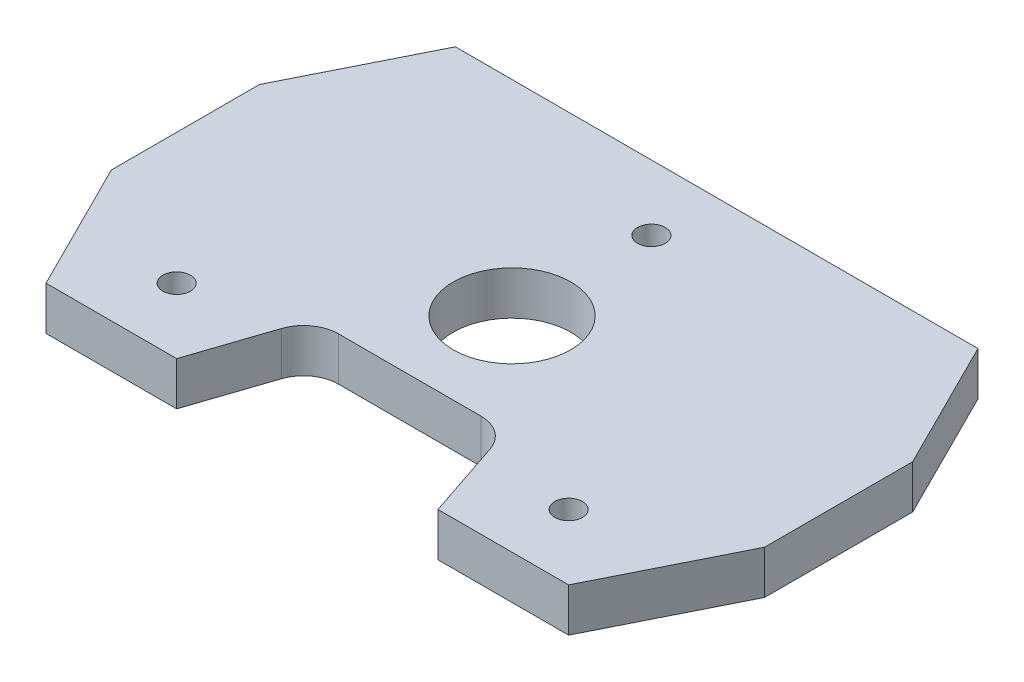
ISO-10303-21;
HEADER;
FILE_DESCRIPTION(('STEP AP214'),'2;1');
FILE_NAME('part.step','',(''),(''),'','','');
FILE_SCHEMA(('AUTOMOTIVE_DESIGN { 1 0 10303 214 1 1 1 1 }'));
ENDSEC;
DATA;
#1=APPLICATION_CONTEXT('core data for automotive mechanical design processes');
#2=APPLICATION_PROTOCOL_DEFINITION('international standard','automotive_design',2000,#1);
#3=PRODUCT_CONTEXT('',#1,'mechanical');
#4=PRODUCT('Part','Part','',(#3));
#5=PRODUCT_RELATED_PRODUCT_CATEGORY('part','',(#4));
#6=PRODUCT_DEFINITION_FORMATION('','',#4);
#7=PRODUCT_DEFINITION_CONTEXT('part definition',#1,'design');
#8=PRODUCT_DEFINITION('design','',#6,#7);
#9=PRODUCT_DEFINITION_SHAPE('','',#8);
#10=(LENGTH_UNIT() NAMED_UNIT(*) SI_UNIT(.MILLI.,.METRE.));
#11=(NAMED_UNIT(*) PLANE_ANGLE_UNIT() SI_UNIT($,.RADIAN.));
#12=(NAMED_UNIT(*) SI_UNIT($,.STERADIAN.) SOLID_ANGLE_UNIT());
#13=UNCERTAINTY_MEASURE_WITH_UNIT(LENGTH_MEASURE(1.E-05),#10,'distance_accuracy_value','');
#14=(GEOMETRIC_REPRESENTATION_CONTEXT(3) GLOBAL_UNCERTAINTY_ASSIGNED_CONTEXT((#13)) GLOBAL_UNIT_ASSIGNED_CONTEXT((#10,
#11,#12)) REPRESENTATION_CONTEXT('',''));
#15=CARTESIAN_POINT('',(0.,0.,0.));
#16=DIRECTION('',(0.,0.,1.));
#17=DIRECTION('',(1.,0.,0.));
#18=AXIS2_PLACEMENT_3D('',#15,#16,#17);
#19=CARTESIAN_POINT('',(-16.364335743494,10.,51.1990291262136));
#20=DIRECTION('',(0.,1.,0.));
#21=DIRECTION('',(0.,0.,1.));
#22=AXIS2_PLACEMENT_3D('',#19,#20,#21);
#23=PLANE('',#22);
#24=CARTESIAN_POINT('',(0.,10.,-12.3009708737864));
#25=DIRECTION('',(0.,1.,0.));
#26=DIRECTION('',(0.,0.,1.));
#27=AXIS2_PLACEMENT_3D('',#24,#25,#26);
#28=CIRCLE('',#27,3.175);
#29=CARTESIAN_POINT('',(0.,10.,-9.12597087378638));
#30=VERTEX_POINT('',#29);
#31=EDGE_CURVE('E316',#30,#30,#28,.T.);
#32=ORIENTED_EDGE('',*,*,#31,.F.);
#33=EDGE_LOOP('',(#32));
#34=FACE_BOUND('',#33,.T.);
#35=CARTESIAN_POINT('',(0.,10.,19.6990291262136));
#36=DIRECTION('',(0.,1.,0.));
#37=DIRECTION('',(0.,0.,1.));
#38=AXIS2_PLACEMENT_3D('',#35,#36,#37);
#39=CIRCLE('',#38,13.5);
#40=CARTESIAN_POINT('',(0.,10.,33.1990291262136));
#41=VERTEX_POINT('',#40);
#42=EDGE_CURVE('E169',#41,#41,#39,.T.);
#43=ORIENTED_EDGE('',*,*,#42,.F.);
#44=EDGE_LOOP('',(#43));
#45=FACE_BOUND('',#44,.T.);
#46=DIRECTION('',(-0.447213595499958,0.,0.894427190999916));
#47=VECTOR('',#46,1.);
#48=CARTESIAN_POINT('',(-60.,10.,-27.3009708737864));
#49=LINE('',#48,#47);
#50=CARTESIAN_POINT('',(-60.,10.,-27.3009708737864));
#51=VERTEX_POINT('',#50);
#52=CARTESIAN_POINT('',(-75.,10.,2.69902912621361));
#53=VERTEX_POINT('',#52);
#54=EDGE_CURVE('E192',#51,#53,#49,.T.);
#55=ORIENTED_EDGE('',*,*,#54,.T.);
#56=DIRECTION('',(0.,0.,1.));
#57=VECTOR('',#56,1.);
#58=CARTESIAN_POINT('',(-75.,10.,2.69902912621361));
#59=LINE('',#58,#57);
#60=CARTESIAN_POINT('',(-75.,10.,36.6990291262136));
#61=VERTEX_POINT('',#60);
#62=EDGE_CURVE('E110',#53,#61,#59,.T.);
#63=ORIENTED_EDGE('',*,*,#62,.T.);
#64=DIRECTION('',(0.447213595499958,0.,0.894427190999916));
#65=VECTOR('',#64,1.);
#66=CARTESIAN_POINT('',(-75.,10.,36.6990291262136));
#67=LINE('',#66,#65);
#68=CARTESIAN_POINT('',(-60.,10.,66.6990291262136));
#69=VERTEX_POINT('',#68);
#70=EDGE_CURVE('E225',#61,#69,#67,.T.);
#71=ORIENTED_EDGE('',*,*,#70,.T.);
#72=DIRECTION('',(1.,0.,0.));
#73=VECTOR('',#72,1.);
#74=CARTESIAN_POINT('',(-60.,10.,66.6990291262136));
#75=LINE('',#74,#73);
#76=CARTESIAN_POINT('',(-30.,10.,66.6990291262136));
#77=VERTEX_POINT('',#76);
#78=EDGE_CURVE('E244',#69,#77,#75,.T.);
#79=ORIENTED_EDGE('',*,*,#78,.T.);
#80=DIRECTION('',(0.317942542314319,0.,-0.948109982959101));
#81=VECTOR('',#80,1.);
#82=CARTESIAN_POINT('',(-30.,10.,66.6990291262136));
#83=LINE('',#82,#81);
#84=CARTESIAN_POINT('',(-23.9492156071668,10.,48.6554887876991));
#85=VERTEX_POINT('',#84);
#86=EDGE_CURVE('E241',#77,#85,#83,.T.);
#87=ORIENTED_EDGE('',*,*,#86,.T.);
#88=CARTESIAN_POINT('',(-16.364335743494,10.,51.1990291262136));
#89=DIRECTION('',(0.,-1.,0.));
#90=DIRECTION('',(0.,0.,1.));
#91=AXIS2_PLACEMENT_3D('',#88,#89,#90);
#92=CIRCLE('',#91,8.);
#93=CARTESIAN_POINT('',(-16.364335743494,10.,43.1990291262136));
#94=VERTEX_POINT('',#93);
#95=EDGE_CURVE('E243',#85,#94,#92,.T.);
#96=ORIENTED_EDGE('',*,*,#95,.T.);
#97=DIRECTION('',(1.,0.,0.));
#98=VECTOR('',#97,1.);
#99=CARTESIAN_POINT('',(16.364335743494,10.,43.1990291262136));
#100=LINE('',#99,#98);
#101=CARTESIAN_POINT('',(16.364335743494,10.,43.1990291262136));
#102=VERTEX_POINT('',#101);
#103=EDGE_CURVE('E246',#94,#102,#100,.T.);
#104=ORIENTED_EDGE('',*,*,#103,.T.);
#105=CARTESIAN_POINT('',(16.364335743494,10.,51.1990291262136));
#106=DIRECTION('',(0.,-1.,0.));
#107=DIRECTION('',(0.,0.,1.));
#108=AXIS2_PLACEMENT_3D('',#105,#106,#107);
#109=CIRCLE('',#108,8.);
#110=CARTESIAN_POINT('',(23.9492156071668,10.,48.6554887876991));
#111=VERTEX_POINT('',#110);
#112=EDGE_CURVE('E252',#102,#111,#109,.T.);
#113=ORIENTED_EDGE('',*,*,#112,.T.);
#114=DIRECTION('',(0.31794254231432,0.,0.948109982959101));
#115=VECTOR('',#114,1.);
#116=CARTESIAN_POINT('',(30.,10.,66.6990291262136));
#117=LINE('',#116,#115);
#118=CARTESIAN_POINT('',(30.,10.,66.6990291262136));
#119=VERTEX_POINT('',#118);
#120=EDGE_CURVE('E254',#111,#119,#117,.T.);
#121=ORIENTED_EDGE('',*,*,#120,.T.);
#122=DIRECTION('',(1.,0.,0.));
#123=VECTOR('',#122,1.);
#124=CARTESIAN_POINT('',(30.,10.,66.6990291262136));
#125=LINE('',#124,#123);
#126=CARTESIAN_POINT('',(60.,10.,66.6990291262136));
#127=VERTEX_POINT('',#126);
#128=EDGE_CURVE('E256',#119,#127,#125,.T.);
#129=ORIENTED_EDGE('',*,*,#128,.T.);
#130=DIRECTION('',(0.447213595499957,0.,-0.894427190999916));
#131=VECTOR('',#130,1.);
#132=CARTESIAN_POINT('',(75.,10.,36.6990291262136));
#133=LINE('',#132,#131);
#134=CARTESIAN_POINT('',(75.,10.,36.6990291262136));
#135=VERTEX_POINT('',#134);
#136=EDGE_CURVE('E147',#127,#135,#133,.T.);
#137=ORIENTED_EDGE('',*,*,#136,.T.);
#138=DIRECTION('',(0.,0.,-1.));
#139=VECTOR('',#138,1.);
#140=CARTESIAN_POINT('',(75.,10.,2.69902912621361));
#141=LINE('',#140,#139);
#142=CARTESIAN_POINT('',(75.,10.,2.69902912621361));
#143=VERTEX_POINT('',#142);
#144=EDGE_CURVE('E141',#135,#143,#141,.T.);
#145=ORIENTED_EDGE('',*,*,#144,.T.);
#146=DIRECTION('',(-0.447213595499958,0.,-0.894427190999916));
#147=VECTOR('',#146,1.);
#148=CARTESIAN_POINT('',(60.,10.,-27.3009708737864));
#149=LINE('',#148,#147);
#150=CARTESIAN_POINT('',(60.,10.,-27.3009708737864));
#151=VERTEX_POINT('',#150);
#152=EDGE_CURVE('E145',#143,#151,#149,.T.);
#153=ORIENTED_EDGE('',*,*,#152,.T.);
#154=DIRECTION('',(-1.,0.,0.));
#155=VECTOR('',#154,1.);
#156=CARTESIAN_POINT('',(-60.,10.,-27.3009708737864));
#157=LINE('',#156,#155);
#158=EDGE_CURVE('E49',#151,#51,#157,.T.);
#159=ORIENTED_EDGE('',*,*,#158,.T.);
#160=EDGE_LOOP('',(#55,#63,#71,#79,#87,#96,#104,#113,#121,#129,#137,#145,#153,#159));
#161=FACE_BOUND('',#160,.T.);
#162=CARTESIAN_POINT('',(-45.,10.,51.6990291262136));
#163=DIRECTION('',(0.,1.,0.));
#164=DIRECTION('',(0.,0.,1.));
#165=AXIS2_PLACEMENT_3D('',#162,#163,#164);
#166=CIRCLE('',#165,3.175);
#167=CARTESIAN_POINT('',(-45.,10.,54.8740291262136));
#168=VERTEX_POINT('',#167);
#169=EDGE_CURVE('E322',#168,#168,#166,.T.);
#170=ORIENTED_EDGE('',*,*,#169,.F.);
#171=EDGE_LOOP('',(#170));
#172=FACE_BOUND('',#171,.T.);
#173=CARTESIAN_POINT('',(45.,10.,51.6990291262136));
#174=DIRECTION('',(0.,1.,0.));
#175=DIRECTION('',(0.,0.,1.));
#176=AXIS2_PLACEMENT_3D('',#173,#174,#175);
#177=CIRCLE('',#176,3.175);
#178=CARTESIAN_POINT('',(45.,10.,54.8740291262136));
#179=VERTEX_POINT('',#178);
#180=EDGE_CURVE('E307',#179,#179,#177,.T.);
#181=ORIENTED_EDGE('',*,*,#180,.F.);
#182=EDGE_LOOP('',(#181));
#183=FACE_BOUND('',#182,.T.);
#184=ADVANCED_FACE('F32',(#34,#45,#161,#172,#183),#23,.T.);
#185=CARTESIAN_POINT('',(-16.364335743494,0.,51.1990291262136));
#186=DIRECTION('',(0.,1.,0.));
#187=DIRECTION('',(0.,0.,1.));
#188=AXIS2_PLACEMENT_3D('',#185,#186,#187);
#189=PLANE('',#188);
#190=DIRECTION('',(-0.447213595499958,0.,0.894427190999916));
#191=VECTOR('',#190,1.);
#192=CARTESIAN_POINT('',(-60.,0.,-27.3009708737864));
#193=LINE('',#192,#191);
#194=CARTESIAN_POINT('',(-60.,0.,-27.3009708737864));
#195=VERTEX_POINT('',#194);
#196=CARTESIAN_POINT('',(-75.,0.,2.69902912621361));
#197=VERTEX_POINT('',#196);
#198=EDGE_CURVE('E165',#195,#197,#193,.T.);
#199=ORIENTED_EDGE('',*,*,#198,.F.);
#200=DIRECTION('',(-1.,0.,0.));
#201=VECTOR('',#200,1.);
#202=CARTESIAN_POINT('',(-60.,0.,-27.3009708737864));
#203=LINE('',#202,#201);
#204=CARTESIAN_POINT('',(60.,0.,-27.3009708737864));
#205=VERTEX_POINT('',#204);
#206=EDGE_CURVE('E102',#205,#195,#203,.T.);
#207=ORIENTED_EDGE('',*,*,#206,.F.);
#208=DIRECTION('',(-0.447213595499958,0.,-0.894427190999916));
#209=VECTOR('',#208,1.);
#210=CARTESIAN_POINT('',(60.,0.,-27.3009708737864));
#211=LINE('',#210,#209);
#212=CARTESIAN_POINT('',(75.,0.,2.69902912621361));
#213=VERTEX_POINT('',#212);
#214=EDGE_CURVE('E96',#213,#205,#211,.T.);
#215=ORIENTED_EDGE('',*,*,#214,.F.);
#216=DIRECTION('',(0.,0.,-1.));
#217=VECTOR('',#216,1.);
#218=CARTESIAN_POINT('',(75.,0.,2.69902912621361));
#219=LINE('',#218,#217);
#220=CARTESIAN_POINT('',(75.,0.,36.6990291262136));
#221=VERTEX_POINT('',#220);
#222=EDGE_CURVE('E155',#221,#213,#219,.T.);
#223=ORIENTED_EDGE('',*,*,#222,.F.);
#224=DIRECTION('',(0.447213595499957,0.,-0.894427190999916));
#225=VECTOR('',#224,1.);
#226=CARTESIAN_POINT('',(75.,0.,36.6990291262136));
#227=LINE('',#226,#225);
#228=CARTESIAN_POINT('',(60.,0.,66.6990291262136));
#229=VERTEX_POINT('',#228);
#230=EDGE_CURVE('E187',#229,#221,#227,.T.);
#231=ORIENTED_EDGE('',*,*,#230,.F.);
#232=DIRECTION('',(1.,0.,0.));
#233=VECTOR('',#232,1.);
#234=CARTESIAN_POINT('',(30.,0.,66.6990291262136));
#235=LINE('',#234,#233);
#236=CARTESIAN_POINT('',(30.,0.,66.6990291262136));
#237=VERTEX_POINT('',#236);
#238=EDGE_CURVE('E185',#237,#229,#235,.T.);
#239=ORIENTED_EDGE('',*,*,#238,.F.);
#240=DIRECTION('',(0.31794254231432,0.,0.948109982959101));
#241=VECTOR('',#240,1.);
#242=CARTESIAN_POINT('',(30.,0.,66.6990291262136));
#243=LINE('',#242,#241);
#244=CARTESIAN_POINT('',(23.9492156071668,0.,48.6554887876991));
#245=VERTEX_POINT('',#244);
#246=EDGE_CURVE('E183',#245,#237,#243,.T.);
#247=ORIENTED_EDGE('',*,*,#246,.F.);
#248=CARTESIAN_POINT('',(16.364335743494,0.,51.1990291262136));
#249=DIRECTION('',(0.,-1.,0.));
#250=DIRECTION('',(0.,0.,1.));
#251=AXIS2_PLACEMENT_3D('',#248,#249,#250);
#252=CIRCLE('',#251,8.);
#253=CARTESIAN_POINT('',(16.364335743494,0.,43.1990291262136));
#254=VERTEX_POINT('',#253);
#255=EDGE_CURVE('E181',#254,#245,#252,.T.);
#256=ORIENTED_EDGE('',*,*,#255,.F.);
#257=DIRECTION('',(1.,0.,0.));
#258=VECTOR('',#257,1.);
#259=CARTESIAN_POINT('',(16.364335743494,0.,43.1990291262136));
#260=LINE('',#259,#258);
#261=CARTESIAN_POINT('',(-16.364335743494,0.,43.1990291262136));
#262=VERTEX_POINT('',#261);
#263=EDGE_CURVE('E179',#262,#254,#260,.T.);
#264=ORIENTED_EDGE('',*,*,#263,.F.);
#265=CARTESIAN_POINT('',(-16.364335743494,0.,51.1990291262136));
#266=DIRECTION('',(0.,-1.,0.));
#267=DIRECTION('',(0.,0.,1.));
#268=AXIS2_PLACEMENT_3D('',#265,#266,#267);
#269=CIRCLE('',#268,8.);
#270=CARTESIAN_POINT('',(-23.9492156071668,0.,48.6554887876991));
#271=VERTEX_POINT('',#270);
#272=EDGE_CURVE('E177',#271,#262,#269,.T.);
#273=ORIENTED_EDGE('',*,*,#272,.F.);
#274=DIRECTION('',(0.317942542314319,0.,-0.948109982959101));
#275=VECTOR('',#274,1.);
#276=CARTESIAN_POINT('',(-30.,0.,66.6990291262136));
#277=LINE('',#276,#275);
#278=CARTESIAN_POINT('',(-30.,0.,66.6990291262136));
#279=VERTEX_POINT('',#278);
#280=EDGE_CURVE('E175',#279,#271,#277,.T.);
#281=ORIENTED_EDGE('',*,*,#280,.F.);
#282=DIRECTION('',(1.,0.,0.));
#283=VECTOR('',#282,1.);
#284=CARTESIAN_POINT('',(-60.,0.,66.6990291262136));
#285=LINE('',#284,#283);
#286=CARTESIAN_POINT('',(-60.,0.,66.6990291262136));
#287=VERTEX_POINT('',#286);
#288=EDGE_CURVE('E173',#287,#279,#285,.T.);
#289=ORIENTED_EDGE('',*,*,#288,.F.);
#290=DIRECTION('',(0.447213595499958,0.,0.894427190999916));
#291=VECTOR('',#290,1.);
#292=CARTESIAN_POINT('',(-75.,0.,36.6990291262136));
#293=LINE('',#292,#291);
#294=CARTESIAN_POINT('',(-75.,0.,36.6990291262136));
#295=VERTEX_POINT('',#294);
#296=EDGE_CURVE('E171',#295,#287,#293,.T.);
#297=ORIENTED_EDGE('',*,*,#296,.F.);
#298=DIRECTION('',(0.,0.,1.));
#299=VECTOR('',#298,1.);
#300=CARTESIAN_POINT('',(-75.,0.,2.69902912621361));
#301=LINE('',#300,#299);
#302=EDGE_CURVE('E168',#197,#295,#301,.T.);
#303=ORIENTED_EDGE('',*,*,#302,.F.);
#304=EDGE_LOOP('',(#199,#207,#215,#223,#231,#239,#247,#256,#264,#273,#281,#289,#297,#303));
#305=FACE_BOUND('',#304,.T.);
#306=CARTESIAN_POINT('',(0.,0.,19.6990291262136));
#307=DIRECTION('',(0.,1.,0.));
#308=DIRECTION('',(0.,0.,1.));
#309=AXIS2_PLACEMENT_3D('',#306,#307,#308);
#310=CIRCLE('',#309,13.5);
#311=CARTESIAN_POINT('',(0.,0.,33.1990291262136));
#312=VERTEX_POINT('',#311);
#313=EDGE_CURVE('E325',#312,#312,#310,.T.);
#314=ORIENTED_EDGE('',*,*,#313,.T.);
#315=EDGE_LOOP('',(#314));
#316=FACE_BOUND('',#315,.T.);
#317=CARTESIAN_POINT('',(-45.,0.,51.6990291262136));
#318=DIRECTION('',(0.,1.,0.));
#319=DIRECTION('',(0.,0.,1.));
#320=AXIS2_PLACEMENT_3D('',#317,#318,#319);
#321=CIRCLE('',#320,3.175);
#322=CARTESIAN_POINT('',(-45.,0.,54.8740291262136));
#323=VERTEX_POINT('',#322);
#324=EDGE_CURVE('E319',#323,#323,#321,.T.);
#325=ORIENTED_EDGE('',*,*,#324,.T.);
#326=EDGE_LOOP('',(#325));
#327=FACE_BOUND('',#326,.T.);
#328=CARTESIAN_POINT('',(0.,0.,-12.3009708737864));
#329=DIRECTION('',(0.,1.,0.));
#330=DIRECTION('',(0.,0.,1.));
#331=AXIS2_PLACEMENT_3D('',#328,#329,#330);
#332=CIRCLE('',#331,3.175);
#333=CARTESIAN_POINT('',(0.,0.,-9.12597087378638));
#334=VERTEX_POINT('',#333);
#335=EDGE_CURVE('E313',#334,#334,#332,.T.);
#336=ORIENTED_EDGE('',*,*,#335,.T.);
#337=EDGE_LOOP('',(#336));
#338=FACE_BOUND('',#337,.T.);
#339=CARTESIAN_POINT('',(45.,0.,51.6990291262136));
#340=DIRECTION('',(0.,1.,0.));
#341=DIRECTION('',(0.,0.,1.));
#342=AXIS2_PLACEMENT_3D('',#339,#340,#341);
#343=CIRCLE('',#342,3.175);
#344=CARTESIAN_POINT('',(45.,0.,54.8740291262136));
#345=VERTEX_POINT('',#344);
#346=EDGE_CURVE('E310',#345,#345,#343,.T.);
#347=ORIENTED_EDGE('',*,*,#346,.T.);
#348=EDGE_LOOP('',(#347));
#349=FACE_BOUND('',#348,.T.);
#350=ADVANCED_FACE('F229',(#305,#316,#327,#338,#349),#189,.F.);
#351=CARTESIAN_POINT('',(-60.,10.,-27.3009708737864));
#352=DIRECTION('',(0.894427190999916,0.,0.447213595499958));
#353=DIRECTION('',(0.447213595499958,0.,-0.894427190999916));
#354=AXIS2_PLACEMENT_3D('',#351,#352,#353);
#355=PLANE('',#354);
#356=ORIENTED_EDGE('',*,*,#198,.T.);
#357=DIRECTION('',(0.,-1.,0.));
#358=VECTOR('',#357,1.);
#359=CARTESIAN_POINT('',(-75.,10.,2.69902912621361));
#360=LINE('',#359,#358);
#361=EDGE_CURVE('E11',#53,#197,#360,.T.);
#362=ORIENTED_EDGE('',*,*,#361,.F.);
#363=ORIENTED_EDGE('',*,*,#54,.F.);
#364=DIRECTION('',(0.,-1.,0.));
#365=VECTOR('',#364,1.);
#366=CARTESIAN_POINT('',(-60.,10.,-27.3009708737864));
#367=LINE('',#366,#365);
#368=EDGE_CURVE('E161',#51,#195,#367,.T.);
#369=ORIENTED_EDGE('',*,*,#368,.T.);
#370=EDGE_LOOP('',(#356,#362,#363,#369));
#371=FACE_BOUND('',#370,.T.);
#372=ADVANCED_FACE('F34',(#371),#355,.F.);
#373=CARTESIAN_POINT('',(-75.,10.,2.69902912621361));
#374=DIRECTION('',(1.,0.,0.));
#375=DIRECTION('',(0.,0.,-1.));
#376=AXIS2_PLACEMENT_3D('',#373,#374,#375);
#377=PLANE('',#376);
#378=ORIENTED_EDGE('',*,*,#302,.T.);
#379=DIRECTION('',(0.,-1.,0.));
#380=VECTOR('',#379,1.);
#381=CARTESIAN_POINT('',(-75.,10.,36.6990291262136));
#382=LINE('',#381,#380);
#383=EDGE_CURVE('E41',#61,#295,#382,.T.);
#384=ORIENTED_EDGE('',*,*,#383,.F.);
#385=ORIENTED_EDGE('',*,*,#62,.F.);
#386=ORIENTED_EDGE('',*,*,#361,.T.);
#387=EDGE_LOOP('',(#378,#384,#385,#386));
#388=FACE_BOUND('',#387,.T.);
#389=ADVANCED_FACE('F455',(#388),#377,.F.);
#390=CARTESIAN_POINT('',(-75.,10.,36.6990291262136));
#391=DIRECTION('',(0.894427190999916,0.,-0.447213595499958));
#392=DIRECTION('',(-0.447213595499958,0.,-0.894427190999916));
#393=AXIS2_PLACEMENT_3D('',#390,#391,#392);
#394=PLANE('',#393);
#395=ORIENTED_EDGE('',*,*,#296,.T.);
#396=DIRECTION('',(0.,-1.,0.));
#397=VECTOR('',#396,1.);
#398=CARTESIAN_POINT('',(-60.,10.,66.6990291262136));
#399=LINE('',#398,#397);
#400=EDGE_CURVE('E217',#69,#287,#399,.T.);
#401=ORIENTED_EDGE('',*,*,#400,.F.);
#402=ORIENTED_EDGE('',*,*,#70,.F.);
#403=ORIENTED_EDGE('',*,*,#383,.T.);
#404=EDGE_LOOP('',(#395,#401,#402,#403));
#405=FACE_BOUND('',#404,.T.);
#406=ADVANCED_FACE('F223',(#405),#394,.F.);
#407=CARTESIAN_POINT('',(-60.,10.,66.6990291262136));
#408=DIRECTION('',(0.,0.,-1.));
#409=DIRECTION('',(-1.,0.,0.));
#410=AXIS2_PLACEMENT_3D('',#407,#408,#409);
#411=PLANE('',#410);
#412=ORIENTED_EDGE('',*,*,#288,.T.);
#413=DIRECTION('',(0.,-1.,0.));
#414=VECTOR('',#413,1.);
#415=CARTESIAN_POINT('',(-30.,10.,66.6990291262136));
#416=LINE('',#415,#414);
#417=EDGE_CURVE('E214',#77,#279,#416,.T.);
#418=ORIENTED_EDGE('',*,*,#417,.F.);
#419=ORIENTED_EDGE('',*,*,#78,.F.);
#420=ORIENTED_EDGE('',*,*,#400,.T.);
#421=EDGE_LOOP('',(#412,#418,#419,#420));
#422=FACE_BOUND('',#421,.T.);
#423=ADVANCED_FACE('F235',(#422),#411,.F.);
#424=CARTESIAN_POINT('',(-30.,10.,66.6990291262136));
#425=DIRECTION('',(-0.948109982959101,0.,-0.317942542314319));
#426=DIRECTION('',(-0.317942542314319,0.,0.948109982959101));
#427=AXIS2_PLACEMENT_3D('',#424,#425,#426);
#428=PLANE('',#427);
#429=ORIENTED_EDGE('',*,*,#280,.T.);
#430=DIRECTION('',(0.,-1.,0.));
#431=VECTOR('',#430,1.);
#432=CARTESIAN_POINT('',(-23.9492156071668,10.,48.6554887876991));
#433=LINE('',#432,#431);
#434=EDGE_CURVE('E211',#85,#271,#433,.T.);
#435=ORIENTED_EDGE('',*,*,#434,.F.);
#436=ORIENTED_EDGE('',*,*,#86,.F.);
#437=ORIENTED_EDGE('',*,*,#417,.T.);
#438=EDGE_LOOP('',(#429,#435,#436,#437));
#439=FACE_BOUND('',#438,.T.);
#440=ADVANCED_FACE('F239',(#439),#428,.F.);
#441=CARTESIAN_POINT('',(-16.364335743494,10.,51.1990291262136));
#442=DIRECTION('',(0.,-1.,0.));
#443=DIRECTION('',(0.,0.,-1.));
#444=AXIS2_PLACEMENT_3D('',#441,#442,#443);
#445=CYLINDRICAL_SURFACE('',#444,8.);
#446=ORIENTED_EDGE('',*,*,#272,.T.);
#447=DIRECTION('',(0.,-1.,0.));
#448=VECTOR('',#447,1.);
#449=CARTESIAN_POINT('',(-16.364335743494,10.,43.1990291262136));
#450=LINE('',#449,#448);
#451=EDGE_CURVE('E208',#94,#262,#450,.T.);
#452=ORIENTED_EDGE('',*,*,#451,.F.);
#453=ORIENTED_EDGE('',*,*,#95,.F.);
#454=ORIENTED_EDGE('',*,*,#434,.T.);
#455=EDGE_LOOP('',(#446,#452,#453,#454));
#456=FACE_BOUND('',#455,.T.);
#457=ADVANCED_FACE('F420',(#456),#445,.F.);
#458=CARTESIAN_POINT('',(16.364335743494,10.,43.1990291262136));
#459=DIRECTION('',(0.,0.,-1.));
#460=DIRECTION('',(-1.,0.,0.));
#461=AXIS2_PLACEMENT_3D('',#458,#459,#460);
#462=PLANE('',#461);
#463=ORIENTED_EDGE('',*,*,#263,.T.);
#464=DIRECTION('',(0.,-1.,0.));
#465=VECTOR('',#464,1.);
#466=CARTESIAN_POINT('',(16.364335743494,10.,43.1990291262136));
#467=LINE('',#466,#465);
#468=EDGE_CURVE('E205',#102,#254,#467,.T.);
#469=ORIENTED_EDGE('',*,*,#468,.F.);
#470=ORIENTED_EDGE('',*,*,#103,.F.);
#471=ORIENTED_EDGE('',*,*,#451,.T.);
#472=EDGE_LOOP('',(#463,#469,#470,#471));
#473=FACE_BOUND('',#472,.T.);
#474=ADVANCED_FACE('F410',(#473),#462,.F.);
#475=CARTESIAN_POINT('',(16.364335743494,10.,51.1990291262136));
#476=DIRECTION('',(0.,-1.,0.));
#477=DIRECTION('',(0.,0.,-1.));
#478=AXIS2_PLACEMENT_3D('',#475,#476,#477);
#479=CYLINDRICAL_SURFACE('',#478,8.);
#480=ORIENTED_EDGE('',*,*,#255,.T.);
#481=DIRECTION('',(0.,-1.,0.));
#482=VECTOR('',#481,1.);
#483=CARTESIAN_POINT('',(23.9492156071668,10.,48.6554887876991));
#484=LINE('',#483,#482);
#485=EDGE_CURVE('E202',#111,#245,#484,.T.);
#486=ORIENTED_EDGE('',*,*,#485,.F.);
#487=ORIENTED_EDGE('',*,*,#112,.F.);
#488=ORIENTED_EDGE('',*,*,#468,.T.);
#489=EDGE_LOOP('',(#480,#486,#487,#488));
#490=FACE_BOUND('',#489,.T.);
#491=ADVANCED_FACE('F400',(#490),#479,.F.);
#492=CARTESIAN_POINT('',(30.,10.,66.6990291262136));
#493=DIRECTION('',(0.948109982959101,0.,-0.31794254231432));
#494=DIRECTION('',(-0.31794254231432,0.,-0.948109982959101));
#495=AXIS2_PLACEMENT_3D('',#492,#493,#494);
#496=PLANE('',#495);
#497=ORIENTED_EDGE('',*,*,#246,.T.);
#498=DIRECTION('',(0.,-1.,0.));
#499=VECTOR('',#498,1.);
#500=CARTESIAN_POINT('',(30.,10.,66.6990291262136));
#501=LINE('',#500,#499);
#502=EDGE_CURVE('E199',#119,#237,#501,.T.);
#503=ORIENTED_EDGE('',*,*,#502,.F.);
#504=ORIENTED_EDGE('',*,*,#120,.F.);
#505=ORIENTED_EDGE('',*,*,#485,.T.);
#506=EDGE_LOOP('',(#497,#503,#504,#505));
#507=FACE_BOUND('',#506,.T.);
#508=ADVANCED_FACE('F391',(#507),#496,.F.);
#509=CARTESIAN_POINT('',(30.,10.,66.6990291262136));
#510=DIRECTION('',(0.,0.,-1.));
#511=DIRECTION('',(-1.,0.,0.));
#512=AXIS2_PLACEMENT_3D('',#509,#510,#511);
#513=PLANE('',#512);
#514=ORIENTED_EDGE('',*,*,#238,.T.);
#515=DIRECTION('',(0.,-1.,0.));
#516=VECTOR('',#515,1.);
#517=CARTESIAN_POINT('',(60.,10.,66.6990291262136));
#518=LINE('',#517,#516);
#519=EDGE_CURVE('E196',#127,#229,#518,.T.);
#520=ORIENTED_EDGE('',*,*,#519,.F.);
#521=ORIENTED_EDGE('',*,*,#128,.F.);
#522=ORIENTED_EDGE('',*,*,#502,.T.);
#523=EDGE_LOOP('',(#514,#520,#521,#522));
#524=FACE_BOUND('',#523,.T.);
#525=ADVANCED_FACE('F262',(#524),#513,.F.);
#526=CARTESIAN_POINT('',(75.,10.,36.6990291262136));
#527=DIRECTION('',(-0.894427190999916,0.,-0.447213595499957));
#528=DIRECTION('',(-0.447213595499958,0.,0.894427190999916));
#529=AXIS2_PLACEMENT_3D('',#526,#527,#528);
#530=PLANE('',#529);
#531=ORIENTED_EDGE('',*,*,#230,.T.);
#532=DIRECTION('',(0.,-1.,0.));
#533=VECTOR('',#532,1.);
#534=CARTESIAN_POINT('',(75.,10.,36.6990291262136));
#535=LINE('',#534,#533);
#536=EDGE_CURVE('E156',#135,#221,#535,.T.);
#537=ORIENTED_EDGE('',*,*,#536,.F.);
#538=ORIENTED_EDGE('',*,*,#136,.F.);
#539=ORIENTED_EDGE('',*,*,#519,.T.);
#540=EDGE_LOOP('',(#531,#537,#538,#539));
#541=FACE_BOUND('',#540,.T.);
#542=ADVANCED_FACE('F266',(#541),#530,.F.);
#543=CARTESIAN_POINT('',(75.,10.,2.69902912621361));
#544=DIRECTION('',(-1.,0.,0.));
#545=DIRECTION('',(0.,0.,1.));
#546=AXIS2_PLACEMENT_3D('',#543,#544,#545);
#547=PLANE('',#546);
#548=ORIENTED_EDGE('',*,*,#222,.T.);
#549=DIRECTION('',(0.,-1.,0.));
#550=VECTOR('',#549,1.);
#551=CARTESIAN_POINT('',(75.,10.,2.69902912621361));
#552=LINE('',#551,#550);
#553=EDGE_CURVE('E152',#143,#213,#552,.T.);
#554=ORIENTED_EDGE('',*,*,#553,.F.);
#555=ORIENTED_EDGE('',*,*,#144,.F.);
#556=ORIENTED_EDGE('',*,*,#536,.T.);
#557=EDGE_LOOP('',(#548,#554,#555,#556));
#558=FACE_BOUND('',#557,.T.);
#559=ADVANCED_FACE('F153',(#558),#547,.F.);
#560=CARTESIAN_POINT('',(60.,10.,-27.3009708737864));
#561=DIRECTION('',(-0.894427190999916,0.,0.447213595499958));
#562=DIRECTION('',(0.447213595499958,0.,0.894427190999916));
#563=AXIS2_PLACEMENT_3D('',#560,#561,#562);
#564=PLANE('',#563);
#565=ORIENTED_EDGE('',*,*,#214,.T.);
#566=DIRECTION('',(0.,-1.,0.));
#567=VECTOR('',#566,1.);
#568=CARTESIAN_POINT('',(60.,10.,-27.3009708737864));
#569=LINE('',#568,#567);
#570=EDGE_CURVE('E157',#151,#205,#569,.T.);
#571=ORIENTED_EDGE('',*,*,#570,.F.);
#572=ORIENTED_EDGE('',*,*,#152,.F.);
#573=ORIENTED_EDGE('',*,*,#553,.T.);
#574=EDGE_LOOP('',(#565,#571,#572,#573));
#575=FACE_BOUND('',#574,.T.);
#576=ADVANCED_FACE('F159',(#575),#564,.F.);
#577=CARTESIAN_POINT('',(-60.,10.,-27.3009708737864));
#578=DIRECTION('',(0.,0.,1.));
#579=DIRECTION('',(1.,0.,0.));
#580=AXIS2_PLACEMENT_3D('',#577,#578,#579);
#581=PLANE('',#580);
#582=ORIENTED_EDGE('',*,*,#206,.T.);
#583=ORIENTED_EDGE('',*,*,#368,.F.);
#584=ORIENTED_EDGE('',*,*,#158,.F.);
#585=ORIENTED_EDGE('',*,*,#570,.T.);
#586=EDGE_LOOP('',(#582,#583,#584,#585));
#587=FACE_BOUND('',#586,.T.);
#588=ADVANCED_FACE('F270',(#587),#581,.F.);
#589=CARTESIAN_POINT('',(0.,10.,19.6990291262136));
#590=DIRECTION('',(0.,-1.,0.));
#591=DIRECTION('',(0.,0.,-1.));
#592=AXIS2_PLACEMENT_3D('',#589,#590,#591);
#593=CYLINDRICAL_SURFACE('',#592,13.5);
#594=ORIENTED_EDGE('',*,*,#42,.T.);
#595=EDGE_LOOP('',(#594));
#596=FACE_BOUND('',#595,.T.);
#597=ORIENTED_EDGE('',*,*,#313,.F.);
#598=EDGE_LOOP('',(#597));
#599=FACE_BOUND('',#598,.T.);
#600=ADVANCED_FACE('F272',(#596,#599),#593,.F.);
#601=CARTESIAN_POINT('',(-45.,10.,51.6990291262136));
#602=DIRECTION('',(0.,-1.,0.));
#603=DIRECTION('',(0.,0.,-1.));
#604=AXIS2_PLACEMENT_3D('',#601,#602,#603);
#605=CYLINDRICAL_SURFACE('',#604,3.175);
#606=ORIENTED_EDGE('',*,*,#169,.T.);
#607=EDGE_LOOP('',(#606));
#608=FACE_BOUND('',#607,.T.);
#609=ORIENTED_EDGE('',*,*,#324,.F.);
#610=EDGE_LOOP('',(#609));
#611=FACE_BOUND('',#610,.T.);
#612=ADVANCED_FACE('F278',(#608,#611),#605,.F.);
#613=CARTESIAN_POINT('',(0.,10.,-12.3009708737864));
#614=DIRECTION('',(0.,-1.,0.));
#615=DIRECTION('',(0.,0.,-1.));
#616=AXIS2_PLACEMENT_3D('',#613,#614,#615);
#617=CYLINDRICAL_SURFACE('',#616,3.175);
#618=ORIENTED_EDGE('',*,*,#31,.T.);
#619=EDGE_LOOP('',(#618));
#620=FACE_BOUND('',#619,.T.);
#621=ORIENTED_EDGE('',*,*,#335,.F.);
#622=EDGE_LOOP('',(#621));
#623=FACE_BOUND('',#622,.T.);
#624=ADVANCED_FACE('F294',(#620,#623),#617,.F.);
#625=CARTESIAN_POINT('',(45.,10.,51.6990291262136));
#626=DIRECTION('',(0.,-1.,0.));
#627=DIRECTION('',(0.,0.,-1.));
#628=AXIS2_PLACEMENT_3D('',#625,#626,#627);
#629=CYLINDRICAL_SURFACE('',#628,3.175);
#630=ORIENTED_EDGE('',*,*,#180,.T.);
#631=EDGE_LOOP('',(#630));
#632=FACE_BOUND('',#631,.T.);
#633=ORIENTED_EDGE('',*,*,#346,.F.);
#634=EDGE_LOOP('',(#633));
#635=FACE_BOUND('',#634,.T.);
#636=ADVANCED_FACE('F298',(#632,#635),#629,.F.);
#637=CLOSED_SHELL('',(#184,#350,#372,#389,#406,#423,#440,#457,#474,#491,#508,#525,#542,#559,
#576,#588,#600,#612,#624,#636));
#638=MANIFOLD_SOLID_BREP('B2',#637);
#639=ADVANCED_BREP_SHAPE_REPRESENTATION('',(#18,#638),#14);
#640=SHAPE_DEFINITION_REPRESENTATION(#9,#639);
ENDSEC;
END-ISO-10303-21;
